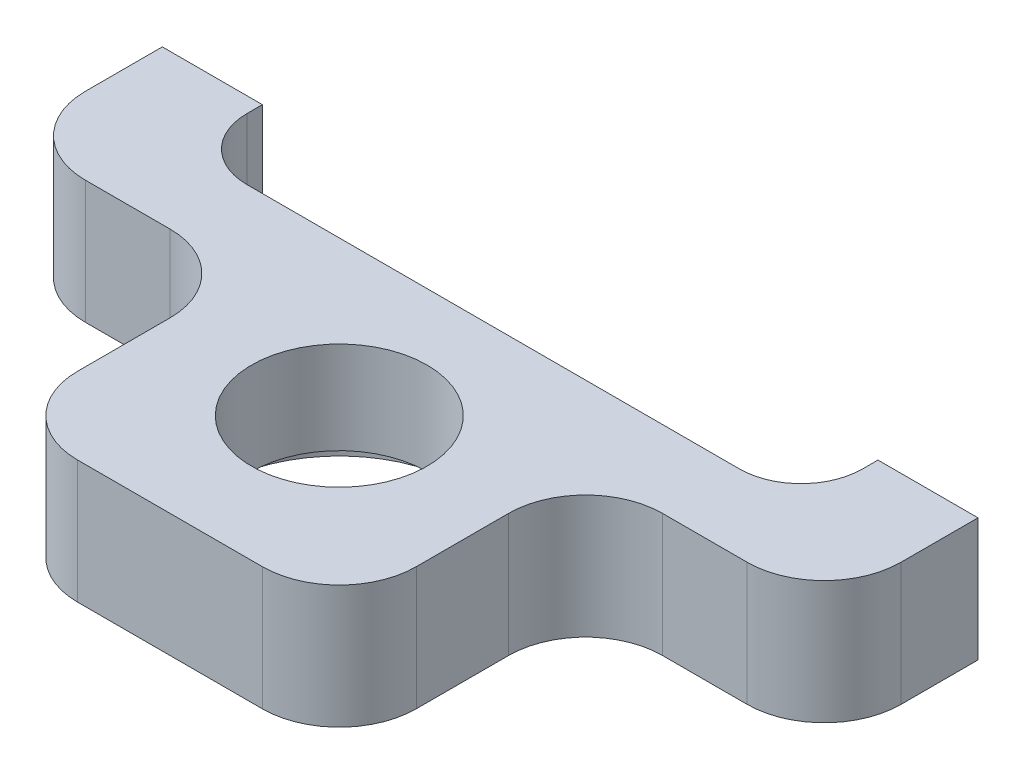
ISO-10303-21;
HEADER;
FILE_DESCRIPTION(('STEP AP214'),'2;1');
FILE_NAME('part.step','',(''),(''),'','','');
FILE_SCHEMA(('AUTOMOTIVE_DESIGN { 1 0 10303 214 1 1 1 1 }'));
ENDSEC;
DATA;
#1=APPLICATION_CONTEXT('core data for automotive mechanical design processes');
#2=APPLICATION_PROTOCOL_DEFINITION('international standard','automotive_design',2000,#1);
#3=PRODUCT_CONTEXT('',#1,'mechanical');
#4=PRODUCT('Part','Part','',(#3));
#5=PRODUCT_RELATED_PRODUCT_CATEGORY('part','',(#4));
#6=PRODUCT_DEFINITION_FORMATION('','',#4);
#7=PRODUCT_DEFINITION_CONTEXT('part definition',#1,'design');
#8=PRODUCT_DEFINITION('design','',#6,#7);
#9=PRODUCT_DEFINITION_SHAPE('','',#8);
#10=(LENGTH_UNIT() NAMED_UNIT(*) SI_UNIT(.MILLI.,.METRE.));
#11=(NAMED_UNIT(*) PLANE_ANGLE_UNIT() SI_UNIT($,.RADIAN.));
#12=(NAMED_UNIT(*) SI_UNIT($,.STERADIAN.) SOLID_ANGLE_UNIT());
#13=UNCERTAINTY_MEASURE_WITH_UNIT(LENGTH_MEASURE(1.E-05),#10,'distance_accuracy_value','');
#14=(GEOMETRIC_REPRESENTATION_CONTEXT(3) GLOBAL_UNCERTAINTY_ASSIGNED_CONTEXT((#13)) GLOBAL_UNIT_ASSIGNED_CONTEXT((#10,
#11,#12)) REPRESENTATION_CONTEXT('',''));
#15=CARTESIAN_POINT('',(0.,0.,0.));
#16=DIRECTION('',(0.,0.,1.));
#17=DIRECTION('',(1.,0.,0.));
#18=AXIS2_PLACEMENT_3D('',#15,#16,#17);
#19=CARTESIAN_POINT('',(-26.5,8.,0.));
#20=DIRECTION('',(0.,0.,-1.));
#21=DIRECTION('',(-1.,0.,0.));
#22=AXIS2_PLACEMENT_3D('',#19,#20,#21);
#23=PLANE('',#22);
#24=CARTESIAN_POINT('',(23.25,4.,0.));
#25=DIRECTION('',(0.,0.,-1.));
#26=DIRECTION('',(-1.,0.,0.));
#27=AXIS2_PLACEMENT_3D('',#24,#25,#26);
#28=CIRCLE('',#27,1.65);
#29=CARTESIAN_POINT('',(21.6,4.,0.));
#30=VERTEX_POINT('',#29);
#31=EDGE_CURVE('E185',#30,#30,#28,.T.);
#32=ORIENTED_EDGE('',*,*,#31,.F.);
#33=EDGE_LOOP('',(#32));
#34=FACE_BOUND('',#33,.T.);
#35=DIRECTION('',(0.,1.,0.));
#36=VECTOR('',#35,1.);
#37=CARTESIAN_POINT('',(20.,0.,0.));
#38=LINE('',#37,#36);
#39=CARTESIAN_POINT('',(20.,0.,0.));
#40=VERTEX_POINT('',#39);
#41=CARTESIAN_POINT('',(20.,8.,0.));
#42=VERTEX_POINT('',#41);
#43=EDGE_CURVE('E224',#40,#42,#38,.T.);
#44=ORIENTED_EDGE('',*,*,#43,.T.);
#45=DIRECTION('',(1.,0.,0.));
#46=VECTOR('',#45,1.);
#47=CARTESIAN_POINT('',(-26.5,8.,0.));
#48=LINE('',#47,#46);
#49=CARTESIAN_POINT('',(26.5,8.,0.));
#50=VERTEX_POINT('',#49);
#51=EDGE_CURVE('E255',#42,#50,#48,.T.);
#52=ORIENTED_EDGE('',*,*,#51,.T.);
#53=DIRECTION('',(0.,-1.,0.));
#54=VECTOR('',#53,1.);
#55=CARTESIAN_POINT('',(26.5,8.,0.));
#56=LINE('',#55,#54);
#57=CARTESIAN_POINT('',(26.5,0.,0.));
#58=VERTEX_POINT('',#57);
#59=EDGE_CURVE('E263',#50,#58,#56,.T.);
#60=ORIENTED_EDGE('',*,*,#59,.T.);
#61=DIRECTION('',(1.,0.,0.));
#62=VECTOR('',#61,1.);
#63=CARTESIAN_POINT('',(-26.5,0.,0.));
#64=LINE('',#63,#62);
#65=EDGE_CURVE('E246',#40,#58,#64,.T.);
#66=ORIENTED_EDGE('',*,*,#65,.F.);
#67=EDGE_LOOP('',(#44,#52,#60,#66));
#68=FACE_BOUND('',#67,.T.);
#69=ADVANCED_FACE('F32',(#34,#68),#23,.T.);
#70=CARTESIAN_POINT('',(-23.25,4.,0.));
#71=DIRECTION('',(0.,0.,-1.));
#72=DIRECTION('',(-1.,0.,0.));
#73=AXIS2_PLACEMENT_3D('',#70,#71,#72);
#74=CIRCLE('',#73,1.65);
#75=CARTESIAN_POINT('',(-24.9,4.,0.));
#76=VERTEX_POINT('',#75);
#77=EDGE_CURVE('E184',#76,#76,#74,.T.);
#78=ORIENTED_EDGE('',*,*,#77,.F.);
#79=EDGE_LOOP('',(#78));
#80=FACE_BOUND('',#79,.T.);
#81=DIRECTION('',(0.,1.,0.));
#82=VECTOR('',#81,1.);
#83=CARTESIAN_POINT('',(-20.000000023,0.,0.));
#84=LINE('',#83,#82);
#85=CARTESIAN_POINT('',(-20.000000023,0.,0.));
#86=VERTEX_POINT('',#85);
#87=CARTESIAN_POINT('',(-20.000000023,8.,0.));
#88=VERTEX_POINT('',#87);
#89=EDGE_CURVE('E217',#86,#88,#84,.T.);
#90=ORIENTED_EDGE('',*,*,#89,.F.);
#91=CARTESIAN_POINT('',(-26.5,0.,0.));
#92=VERTEX_POINT('',#91);
#93=EDGE_CURVE('E264',#92,#86,#64,.T.);
#94=ORIENTED_EDGE('',*,*,#93,.F.);
#95=DIRECTION('',(0.,-1.,0.));
#96=VECTOR('',#95,1.);
#97=CARTESIAN_POINT('',(-26.5,8.,0.));
#98=LINE('',#97,#96);
#99=CARTESIAN_POINT('',(-26.5,8.,0.));
#100=VERTEX_POINT('',#99);
#101=EDGE_CURVE('E275',#100,#92,#98,.T.);
#102=ORIENTED_EDGE('',*,*,#101,.F.);
#103=EDGE_CURVE('E251',#100,#88,#48,.T.);
#104=ORIENTED_EDGE('',*,*,#103,.T.);
#105=EDGE_LOOP('',(#90,#94,#102,#104));
#106=FACE_BOUND('',#105,.T.);
#107=ADVANCED_FACE('F371',(#80,#106),#23,.T.);
#108=CARTESIAN_POINT('',(-26.5,8.,26.));
#109=DIRECTION('',(-1.,0.,0.));
#110=DIRECTION('',(0.,0.,1.));
#111=AXIS2_PLACEMENT_3D('',#108,#109,#110);
#112=PLANE('',#111);
#113=DIRECTION('',(0.,0.,-1.));
#114=VECTOR('',#113,1.);
#115=CARTESIAN_POINT('',(-26.5,0.,26.));
#116=LINE('',#115,#114);
#117=CARTESIAN_POINT('',(-26.5,0.,5.));
#118=VERTEX_POINT('',#117);
#119=EDGE_CURVE('E273',#118,#92,#116,.T.);
#120=ORIENTED_EDGE('',*,*,#119,.F.);
#121=DIRECTION('',(0.,1.,0.));
#122=VECTOR('',#121,1.);
#123=CARTESIAN_POINT('',(-26.5,8.,5.00000000000001));
#124=LINE('',#123,#122);
#125=CARTESIAN_POINT('',(-26.5,8.,5.));
#126=VERTEX_POINT('',#125);
#127=EDGE_CURVE('E320',#118,#126,#124,.T.);
#128=ORIENTED_EDGE('',*,*,#127,.T.);
#129=DIRECTION('',(0.,0.,-1.));
#130=VECTOR('',#129,1.);
#131=CARTESIAN_POINT('',(-26.5,8.,26.));
#132=LINE('',#131,#130);
#133=EDGE_CURVE('E261',#126,#100,#132,.T.);
#134=ORIENTED_EDGE('',*,*,#133,.T.);
#135=ORIENTED_EDGE('',*,*,#101,.T.);
#136=EDGE_LOOP('',(#120,#128,#134,#135));
#137=FACE_BOUND('',#136,.T.);
#138=ADVANCED_FACE('F365',(#137),#112,.T.);
#139=CARTESIAN_POINT('',(26.5,8.,26.));
#140=DIRECTION('',(0.,0.,1.));
#141=DIRECTION('',(1.,0.,0.));
#142=AXIS2_PLACEMENT_3D('',#139,#140,#141);
#143=PLANE('',#142);
#144=DIRECTION('',(-1.,0.,0.));
#145=VECTOR('',#144,1.);
#146=CARTESIAN_POINT('',(26.5,0.,26.));
#147=LINE('',#146,#145);
#148=CARTESIAN_POINT('',(6.,0.,26.));
#149=VERTEX_POINT('',#148);
#150=CARTESIAN_POINT('',(-6.,0.,26.));
#151=VERTEX_POINT('',#150);
#152=EDGE_CURVE('E270',#149,#151,#147,.T.);
#153=ORIENTED_EDGE('',*,*,#152,.F.);
#154=DIRECTION('',(0.,1.,0.));
#155=VECTOR('',#154,1.);
#156=CARTESIAN_POINT('',(6.,8.,26.));
#157=LINE('',#156,#155);
#158=CARTESIAN_POINT('',(6.,8.,26.));
#159=VERTEX_POINT('',#158);
#160=EDGE_CURVE('E334',#149,#159,#157,.T.);
#161=ORIENTED_EDGE('',*,*,#160,.T.);
#162=DIRECTION('',(-1.,0.,0.));
#163=VECTOR('',#162,1.);
#164=CARTESIAN_POINT('',(26.5,8.,26.));
#165=LINE('',#164,#163);
#166=CARTESIAN_POINT('',(-6.,8.,26.));
#167=VERTEX_POINT('',#166);
#168=EDGE_CURVE('E258',#159,#167,#165,.T.);
#169=ORIENTED_EDGE('',*,*,#168,.T.);
#170=DIRECTION('',(0.,1.,0.));
#171=VECTOR('',#170,1.);
#172=CARTESIAN_POINT('',(-6.,0.,26.));
#173=LINE('',#172,#171);
#174=EDGE_CURVE('E332',#167,#151,#173,.F.);
#175=ORIENTED_EDGE('',*,*,#174,.T.);
#176=EDGE_LOOP('',(#153,#161,#169,#175));
#177=FACE_BOUND('',#176,.T.);
#178=ADVANCED_FACE('F426',(#177),#143,.T.);
#179=CARTESIAN_POINT('',(26.5,8.,0.));
#180=DIRECTION('',(1.,0.,0.));
#181=DIRECTION('',(0.,0.,-1.));
#182=AXIS2_PLACEMENT_3D('',#179,#180,#181);
#183=PLANE('',#182);
#184=DIRECTION('',(0.,0.,1.));
#185=VECTOR('',#184,1.);
#186=CARTESIAN_POINT('',(26.5,8.,0.));
#187=LINE('',#186,#185);
#188=CARTESIAN_POINT('',(26.5,8.,5.));
#189=VERTEX_POINT('',#188);
#190=EDGE_CURVE('E254',#50,#189,#187,.T.);
#191=ORIENTED_EDGE('',*,*,#190,.T.);
#192=DIRECTION('',(0.,1.,0.));
#193=VECTOR('',#192,1.);
#194=CARTESIAN_POINT('',(26.5,0.,5.));
#195=LINE('',#194,#193);
#196=CARTESIAN_POINT('',(26.5,0.,5.));
#197=VERTEX_POINT('',#196);
#198=EDGE_CURVE('E311',#189,#197,#195,.F.);
#199=ORIENTED_EDGE('',*,*,#198,.T.);
#200=DIRECTION('',(0.,0.,1.));
#201=VECTOR('',#200,1.);
#202=CARTESIAN_POINT('',(26.5,0.,0.));
#203=LINE('',#202,#201);
#204=EDGE_CURVE('E267',#58,#197,#203,.T.);
#205=ORIENTED_EDGE('',*,*,#204,.F.);
#206=ORIENTED_EDGE('',*,*,#59,.F.);
#207=EDGE_LOOP('',(#191,#199,#205,#206));
#208=FACE_BOUND('',#207,.T.);
#209=ADVANCED_FACE('F401',(#208),#183,.T.);
#210=CARTESIAN_POINT('',(0.,8.,0.));
#211=DIRECTION('',(0.,-1.,0.));
#212=DIRECTION('',(0.,0.,-1.));
#213=AXIS2_PLACEMENT_3D('',#210,#211,#212);
#214=PLANE('',#213);
#215=CARTESIAN_POINT('',(0.,8.00000000000001,15.));
#216=DIRECTION('',(0.,-1.,0.));
#217=DIRECTION('',(0.,0.,-1.));
#218=AXIS2_PLACEMENT_3D('',#215,#216,#217);
#219=CIRCLE('',#218,5.70000000000001);
#220=CARTESIAN_POINT('',(0.,8.00000000000001,9.29999999999999));
#221=VERTEX_POINT('',#220);
#222=EDGE_CURVE('E204',#221,#221,#219,.T.);
#223=ORIENTED_EDGE('',*,*,#222,.T.);
#224=EDGE_LOOP('',(#223));
#225=FACE_BOUND('',#224,.T.);
#226=DIRECTION('',(-1.,0.,0.));
#227=VECTOR('',#226,1.);
#228=CARTESIAN_POINT('',(26.5,8.,10.));
#229=LINE('',#228,#227);
#230=CARTESIAN_POINT('',(21.5,8.,10.));
#231=VERTEX_POINT('',#230);
#232=CARTESIAN_POINT('',(16.,8.,10.));
#233=VERTEX_POINT('',#232);
#234=EDGE_CURVE('E235',#231,#233,#229,.T.);
#235=ORIENTED_EDGE('',*,*,#234,.F.);
#236=CARTESIAN_POINT('',(21.5,8.,5.));
#237=DIRECTION('',(0.,-1.,0.));
#238=DIRECTION('',(0.,0.,-1.));
#239=AXIS2_PLACEMENT_3D('',#236,#237,#238);
#240=CIRCLE('',#239,5.);
#241=EDGE_CURVE('E309',#231,#189,#240,.F.);
#242=ORIENTED_EDGE('',*,*,#241,.T.);
#243=ORIENTED_EDGE('',*,*,#190,.F.);
#244=ORIENTED_EDGE('',*,*,#51,.F.);
#245=DIRECTION('',(0.,0.,-1.));
#246=VECTOR('',#245,1.);
#247=CARTESIAN_POINT('',(20.,8.,5.));
#248=LINE('',#247,#246);
#249=CARTESIAN_POINT('',(20.,8.,1.));
#250=VERTEX_POINT('',#249);
#251=EDGE_CURVE('E212',#250,#42,#248,.T.);
#252=ORIENTED_EDGE('',*,*,#251,.F.);
#253=CARTESIAN_POINT('',(16.,8.,1.));
#254=DIRECTION('',(0.,-1.,0.));
#255=DIRECTION('',(0.,0.,-1.));
#256=AXIS2_PLACEMENT_3D('',#253,#254,#255);
#257=CIRCLE('',#256,4.);
#258=CARTESIAN_POINT('',(16.,8.,5.));
#259=VERTEX_POINT('',#258);
#260=EDGE_CURVE('E294',#250,#259,#257,.T.);
#261=ORIENTED_EDGE('',*,*,#260,.T.);
#262=DIRECTION('',(1.,0.,0.));
#263=VECTOR('',#262,1.);
#264=CARTESIAN_POINT('',(-20.000000023,8.,5.00000000000001));
#265=LINE('',#264,#263);
#266=CARTESIAN_POINT('',(-16.000000023,8.,5.00000000000001));
#267=VERTEX_POINT('',#266);
#268=EDGE_CURVE('E220',#267,#259,#265,.T.);
#269=ORIENTED_EDGE('',*,*,#268,.F.);
#270=CARTESIAN_POINT('',(-16.000000023,8.,1.00000000000001));
#271=DIRECTION('',(0.,-1.,0.));
#272=DIRECTION('',(0.,0.,-1.));
#273=AXIS2_PLACEMENT_3D('',#270,#271,#272);
#274=CIRCLE('',#273,4.);
#275=CARTESIAN_POINT('',(-20.000000023,8.,1.00000000000001));
#276=VERTEX_POINT('',#275);
#277=EDGE_CURVE('E290',#267,#276,#274,.T.);
#278=ORIENTED_EDGE('',*,*,#277,.T.);
#279=DIRECTION('',(0.,0.,1.));
#280=VECTOR('',#279,1.);
#281=CARTESIAN_POINT('',(-20.000000023,8.,0.));
#282=LINE('',#281,#280);
#283=EDGE_CURVE('E207',#88,#276,#282,.T.);
#284=ORIENTED_EDGE('',*,*,#283,.F.);
#285=ORIENTED_EDGE('',*,*,#103,.F.);
#286=ORIENTED_EDGE('',*,*,#133,.F.);
#287=CARTESIAN_POINT('',(-21.5,8.,5.));
#288=DIRECTION('',(0.,-1.,0.));
#289=DIRECTION('',(0.,0.,-1.));
#290=AXIS2_PLACEMENT_3D('',#287,#288,#289);
#291=CIRCLE('',#290,5.);
#292=CARTESIAN_POINT('',(-21.5,8.,10.));
#293=VERTEX_POINT('',#292);
#294=EDGE_CURVE('E307',#126,#293,#291,.F.);
#295=ORIENTED_EDGE('',*,*,#294,.T.);
#296=DIRECTION('',(-1.,0.,0.));
#297=VECTOR('',#296,1.);
#298=CARTESIAN_POINT('',(-11.,8.,10.));
#299=LINE('',#298,#297);
#300=CARTESIAN_POINT('',(-16.,8.,10.));
#301=VERTEX_POINT('',#300);
#302=EDGE_CURVE('E233',#301,#293,#299,.T.);
#303=ORIENTED_EDGE('',*,*,#302,.F.);
#304=CARTESIAN_POINT('',(-16.,8.,15.));
#305=DIRECTION('',(0.,-1.,0.));
#306=DIRECTION('',(0.,0.,-1.));
#307=AXIS2_PLACEMENT_3D('',#304,#305,#306);
#308=CIRCLE('',#307,5.);
#309=CARTESIAN_POINT('',(-11.,8.,15.));
#310=VERTEX_POINT('',#309);
#311=EDGE_CURVE('E40',#301,#310,#308,.T.);
#312=ORIENTED_EDGE('',*,*,#311,.T.);
#313=DIRECTION('',(0.,0.,-1.));
#314=VECTOR('',#313,1.);
#315=CARTESIAN_POINT('',(-11.,8.,26.));
#316=LINE('',#315,#314);
#317=CARTESIAN_POINT('',(-11.,8.,21.));
#318=VERTEX_POINT('',#317);
#319=EDGE_CURVE('E227',#318,#310,#316,.T.);
#320=ORIENTED_EDGE('',*,*,#319,.F.);
#321=CARTESIAN_POINT('',(-6.,8.,21.));
#322=DIRECTION('',(0.,-1.,0.));
#323=DIRECTION('',(0.,0.,-1.));
#324=AXIS2_PLACEMENT_3D('',#321,#322,#323);
#325=CIRCLE('',#324,5.);
#326=EDGE_CURVE('E303',#318,#167,#325,.F.);
#327=ORIENTED_EDGE('',*,*,#326,.T.);
#328=ORIENTED_EDGE('',*,*,#168,.F.);
#329=CARTESIAN_POINT('',(6.,8.,21.));
#330=DIRECTION('',(0.,-1.,0.));
#331=DIRECTION('',(0.,0.,-1.));
#332=AXIS2_PLACEMENT_3D('',#329,#330,#331);
#333=CIRCLE('',#332,5.);
#334=CARTESIAN_POINT('',(11.,8.,21.));
#335=VERTEX_POINT('',#334);
#336=EDGE_CURVE('E305',#159,#335,#333,.F.);
#337=ORIENTED_EDGE('',*,*,#336,.T.);
#338=DIRECTION('',(0.,0.,1.));
#339=VECTOR('',#338,1.);
#340=CARTESIAN_POINT('',(11.,8.,10.));
#341=LINE('',#340,#339);
#342=CARTESIAN_POINT('',(11.,8.,15.));
#343=VERTEX_POINT('',#342);
#344=EDGE_CURVE('E243',#343,#335,#341,.T.);
#345=ORIENTED_EDGE('',*,*,#344,.F.);
#346=CARTESIAN_POINT('',(16.,8.,15.));
#347=DIRECTION('',(0.,-1.,0.));
#348=DIRECTION('',(0.,0.,-1.));
#349=AXIS2_PLACEMENT_3D('',#346,#347,#348);
#350=CIRCLE('',#349,5.);
#351=EDGE_CURVE('E342',#343,#233,#350,.T.);
#352=ORIENTED_EDGE('',*,*,#351,.T.);
#353=EDGE_LOOP('',(#235,#242,#243,#244,#252,#261,#269,#278,#284,#285,#286,#295,#303,#312,#320,
#327,#328,#337,#345,#352));
#354=FACE_BOUND('',#353,.T.);
#355=ADVANCED_FACE('F349',(#225,#354),#214,.F.);
#356=CARTESIAN_POINT('',(0.,0.,0.));
#357=DIRECTION('',(0.,-1.,0.));
#358=DIRECTION('',(0.,0.,-1.));
#359=AXIS2_PLACEMENT_3D('',#356,#357,#358);
#360=PLANE('',#359);
#361=CARTESIAN_POINT('',(0.,0.,15.));
#362=DIRECTION('',(0.,-1.,0.));
#363=DIRECTION('',(0.,0.,-1.));
#364=AXIS2_PLACEMENT_3D('',#361,#362,#363);
#365=CIRCLE('',#364,8.1);
#366=CARTESIAN_POINT('',(0.,0.,6.9));
#367=VERTEX_POINT('',#366);
#368=EDGE_CURVE('E195',#367,#367,#365,.T.);
#369=ORIENTED_EDGE('',*,*,#368,.F.);
#370=EDGE_LOOP('',(#369));
#371=FACE_BOUND('',#370,.T.);
#372=ORIENTED_EDGE('',*,*,#204,.T.);
#373=CARTESIAN_POINT('',(21.5,0.,5.));
#374=DIRECTION('',(0.,-1.,0.));
#375=DIRECTION('',(0.,0.,-1.));
#376=AXIS2_PLACEMENT_3D('',#373,#374,#375);
#377=CIRCLE('',#376,5.);
#378=CARTESIAN_POINT('',(21.5,0.,10.));
#379=VERTEX_POINT('',#378);
#380=EDGE_CURVE('E318',#197,#379,#377,.T.);
#381=ORIENTED_EDGE('',*,*,#380,.T.);
#382=DIRECTION('',(-1.,0.,0.));
#383=VECTOR('',#382,1.);
#384=CARTESIAN_POINT('',(26.5,0.,10.));
#385=LINE('',#384,#383);
#386=CARTESIAN_POINT('',(16.,0.,10.));
#387=VERTEX_POINT('',#386);
#388=EDGE_CURVE('E239',#379,#387,#385,.T.);
#389=ORIENTED_EDGE('',*,*,#388,.T.);
#390=CARTESIAN_POINT('',(16.,0.,15.));
#391=DIRECTION('',(0.,-1.,0.));
#392=DIRECTION('',(0.,0.,-1.));
#393=AXIS2_PLACEMENT_3D('',#390,#391,#392);
#394=CIRCLE('',#393,5.);
#395=CARTESIAN_POINT('',(11.,0.,15.));
#396=VERTEX_POINT('',#395);
#397=EDGE_CURVE('E344',#387,#396,#394,.F.);
#398=ORIENTED_EDGE('',*,*,#397,.T.);
#399=DIRECTION('',(0.,0.,1.));
#400=VECTOR('',#399,1.);
#401=CARTESIAN_POINT('',(11.,0.,10.));
#402=LINE('',#401,#400);
#403=CARTESIAN_POINT('',(11.,0.,21.));
#404=VERTEX_POINT('',#403);
#405=EDGE_CURVE('E242',#396,#404,#402,.T.);
#406=ORIENTED_EDGE('',*,*,#405,.T.);
#407=CARTESIAN_POINT('',(6.,0.,21.));
#408=DIRECTION('',(0.,-1.,0.));
#409=DIRECTION('',(0.,0.,-1.));
#410=AXIS2_PLACEMENT_3D('',#407,#408,#409);
#411=CIRCLE('',#410,5.);
#412=EDGE_CURVE('E315',#404,#149,#411,.T.);
#413=ORIENTED_EDGE('',*,*,#412,.T.);
#414=ORIENTED_EDGE('',*,*,#152,.T.);
#415=CARTESIAN_POINT('',(-6.,0.,21.));
#416=DIRECTION('',(0.,-1.,0.));
#417=DIRECTION('',(0.,0.,-1.));
#418=AXIS2_PLACEMENT_3D('',#415,#416,#417);
#419=CIRCLE('',#418,5.);
#420=CARTESIAN_POINT('',(-11.,0.,21.));
#421=VERTEX_POINT('',#420);
#422=EDGE_CURVE('E313',#151,#421,#419,.T.);
#423=ORIENTED_EDGE('',*,*,#422,.T.);
#424=DIRECTION('',(0.,0.,-1.));
#425=VECTOR('',#424,1.);
#426=CARTESIAN_POINT('',(-11.,0.,26.));
#427=LINE('',#426,#425);
#428=CARTESIAN_POINT('',(-11.,0.,15.));
#429=VERTEX_POINT('',#428);
#430=EDGE_CURVE('E229',#421,#429,#427,.T.);
#431=ORIENTED_EDGE('',*,*,#430,.T.);
#432=CARTESIAN_POINT('',(-16.,0.,15.));
#433=DIRECTION('',(0.,-1.,0.));
#434=DIRECTION('',(0.,0.,-1.));
#435=AXIS2_PLACEMENT_3D('',#432,#433,#434);
#436=CIRCLE('',#435,5.);
#437=CARTESIAN_POINT('',(-16.,0.,10.));
#438=VERTEX_POINT('',#437);
#439=EDGE_CURVE('E11',#429,#438,#436,.F.);
#440=ORIENTED_EDGE('',*,*,#439,.T.);
#441=DIRECTION('',(-1.,0.,0.));
#442=VECTOR('',#441,1.);
#443=CARTESIAN_POINT('',(-11.,0.,10.));
#444=LINE('',#443,#442);
#445=CARTESIAN_POINT('',(-21.5,0.,10.));
#446=VERTEX_POINT('',#445);
#447=EDGE_CURVE('E232',#438,#446,#444,.T.);
#448=ORIENTED_EDGE('',*,*,#447,.T.);
#449=CARTESIAN_POINT('',(-21.5,0.,5.));
#450=DIRECTION('',(0.,-1.,0.));
#451=DIRECTION('',(0.,0.,-1.));
#452=AXIS2_PLACEMENT_3D('',#449,#450,#451);
#453=CIRCLE('',#452,5.);
#454=EDGE_CURVE('E47',#446,#118,#453,.T.);
#455=ORIENTED_EDGE('',*,*,#454,.T.);
#456=ORIENTED_EDGE('',*,*,#119,.T.);
#457=ORIENTED_EDGE('',*,*,#93,.T.);
#458=DIRECTION('',(0.,0.,1.));
#459=VECTOR('',#458,1.);
#460=CARTESIAN_POINT('',(-20.000000023,0.,0.));
#461=LINE('',#460,#459);
#462=CARTESIAN_POINT('',(-20.000000023,0.,1.00000000000001));
#463=VERTEX_POINT('',#462);
#464=EDGE_CURVE('E208',#86,#463,#461,.T.);
#465=ORIENTED_EDGE('',*,*,#464,.T.);
#466=CARTESIAN_POINT('',(-16.000000023,0.,1.00000000000001));
#467=DIRECTION('',(0.,-1.,0.));
#468=DIRECTION('',(0.,0.,-1.));
#469=AXIS2_PLACEMENT_3D('',#466,#467,#468);
#470=CIRCLE('',#469,4.);
#471=CARTESIAN_POINT('',(-16.000000023,0.,5.00000000000001));
#472=VERTEX_POINT('',#471);
#473=EDGE_CURVE('E292',#463,#472,#470,.F.);
#474=ORIENTED_EDGE('',*,*,#473,.T.);
#475=DIRECTION('',(1.,0.,0.));
#476=VECTOR('',#475,1.);
#477=CARTESIAN_POINT('',(-20.000000023,0.,5.00000000000001));
#478=LINE('',#477,#476);
#479=CARTESIAN_POINT('',(16.,0.,5.));
#480=VERTEX_POINT('',#479);
#481=EDGE_CURVE('E211',#472,#480,#478,.T.);
#482=ORIENTED_EDGE('',*,*,#481,.T.);
#483=CARTESIAN_POINT('',(16.,0.,1.));
#484=DIRECTION('',(0.,-1.,0.));
#485=DIRECTION('',(0.,0.,-1.));
#486=AXIS2_PLACEMENT_3D('',#483,#484,#485);
#487=CIRCLE('',#486,4.);
#488=CARTESIAN_POINT('',(20.,0.,1.));
#489=VERTEX_POINT('',#488);
#490=EDGE_CURVE('E296',#480,#489,#487,.F.);
#491=ORIENTED_EDGE('',*,*,#490,.T.);
#492=DIRECTION('',(0.,0.,-1.));
#493=VECTOR('',#492,1.);
#494=CARTESIAN_POINT('',(20.,0.,5.));
#495=LINE('',#494,#493);
#496=EDGE_CURVE('E215',#489,#40,#495,.T.);
#497=ORIENTED_EDGE('',*,*,#496,.T.);
#498=ORIENTED_EDGE('',*,*,#65,.T.);
#499=EDGE_LOOP('',(#372,#381,#389,#398,#406,#413,#414,#423,#431,#440,#448,#455,#456,#457,#465,
#474,#482,#491,#497,#498));
#500=FACE_BOUND('',#499,.T.);
#501=ADVANCED_FACE('F358',(#371,#500),#360,.T.);
#502=CARTESIAN_POINT('',(26.5,0.,10.));
#503=DIRECTION('',(0.,0.,-1.));
#504=DIRECTION('',(-1.,0.,0.));
#505=AXIS2_PLACEMENT_3D('',#502,#503,#504);
#506=PLANE('',#505);
#507=ORIENTED_EDGE('',*,*,#388,.F.);
#508=DIRECTION('',(0.,1.,0.));
#509=VECTOR('',#508,1.);
#510=CARTESIAN_POINT('',(21.5,8.,10.));
#511=LINE('',#510,#509);
#512=EDGE_CURVE('E300',#379,#231,#511,.T.);
#513=ORIENTED_EDGE('',*,*,#512,.T.);
#514=ORIENTED_EDGE('',*,*,#234,.T.);
#515=DIRECTION('',(0.,1.,0.));
#516=VECTOR('',#515,1.);
#517=CARTESIAN_POINT('',(16.,0.,10.));
#518=LINE('',#517,#516);
#519=EDGE_CURVE('E298',#233,#387,#518,.F.);
#520=ORIENTED_EDGE('',*,*,#519,.T.);
#521=EDGE_LOOP('',(#507,#513,#514,#520));
#522=FACE_BOUND('',#521,.T.);
#523=ADVANCED_FACE('F409',(#522),#506,.F.);
#524=CARTESIAN_POINT('',(11.,0.,10.));
#525=DIRECTION('',(-1.,0.,0.));
#526=DIRECTION('',(0.,0.,1.));
#527=AXIS2_PLACEMENT_3D('',#524,#525,#526);
#528=PLANE('',#527);
#529=ORIENTED_EDGE('',*,*,#405,.F.);
#530=DIRECTION('',(0.,1.,0.));
#531=VECTOR('',#530,1.);
#532=CARTESIAN_POINT('',(11.,8.,15.));
#533=LINE('',#532,#531);
#534=EDGE_CURVE('E329',#396,#343,#533,.T.);
#535=ORIENTED_EDGE('',*,*,#534,.T.);
#536=ORIENTED_EDGE('',*,*,#344,.T.);
#537=DIRECTION('',(0.,1.,0.));
#538=VECTOR('',#537,1.);
#539=CARTESIAN_POINT('',(11.,0.,21.));
#540=LINE('',#539,#538);
#541=EDGE_CURVE('E327',#335,#404,#540,.F.);
#542=ORIENTED_EDGE('',*,*,#541,.T.);
#543=EDGE_LOOP('',(#529,#535,#536,#542));
#544=FACE_BOUND('',#543,.T.);
#545=ADVANCED_FACE('F417',(#544),#528,.F.);
#546=CARTESIAN_POINT('',(-11.,0.,10.));
#547=DIRECTION('',(0.,0.,-1.));
#548=DIRECTION('',(-1.,0.,0.));
#549=AXIS2_PLACEMENT_3D('',#546,#547,#548);
#550=PLANE('',#549);
#551=ORIENTED_EDGE('',*,*,#302,.T.);
#552=DIRECTION('',(0.,1.,0.));
#553=VECTOR('',#552,1.);
#554=CARTESIAN_POINT('',(-21.5,0.,10.));
#555=LINE('',#554,#553);
#556=EDGE_CURVE('E55',#293,#446,#555,.F.);
#557=ORIENTED_EDGE('',*,*,#556,.T.);
#558=ORIENTED_EDGE('',*,*,#447,.F.);
#559=DIRECTION('',(0.,1.,0.));
#560=VECTOR('',#559,1.);
#561=CARTESIAN_POINT('',(-16.,8.,10.));
#562=LINE('',#561,#560);
#563=EDGE_CURVE('E323',#438,#301,#562,.T.);
#564=ORIENTED_EDGE('',*,*,#563,.T.);
#565=EDGE_LOOP('',(#551,#557,#558,#564));
#566=FACE_BOUND('',#565,.T.);
#567=ADVANCED_FACE('F359',(#566),#550,.F.);
#568=CARTESIAN_POINT('',(-11.,0.,26.));
#569=DIRECTION('',(1.,0.,0.));
#570=DIRECTION('',(0.,0.,-1.));
#571=AXIS2_PLACEMENT_3D('',#568,#569,#570);
#572=PLANE('',#571);
#573=ORIENTED_EDGE('',*,*,#430,.F.);
#574=DIRECTION('',(0.,1.,0.));
#575=VECTOR('',#574,1.);
#576=CARTESIAN_POINT('',(-11.,8.,21.));
#577=LINE('',#576,#575);
#578=EDGE_CURVE('E339',#421,#318,#577,.T.);
#579=ORIENTED_EDGE('',*,*,#578,.T.);
#580=ORIENTED_EDGE('',*,*,#319,.T.);
#581=DIRECTION('',(0.,1.,0.));
#582=VECTOR('',#581,1.);
#583=CARTESIAN_POINT('',(-11.,0.,15.));
#584=LINE('',#583,#582);
#585=EDGE_CURVE('E337',#310,#429,#584,.F.);
#586=ORIENTED_EDGE('',*,*,#585,.T.);
#587=EDGE_LOOP('',(#573,#579,#580,#586));
#588=FACE_BOUND('',#587,.T.);
#589=ADVANCED_FACE('F355',(#588),#572,.F.);
#590=CARTESIAN_POINT('',(20.,0.,5.));
#591=DIRECTION('',(1.,0.,0.));
#592=DIRECTION('',(0.,0.,-1.));
#593=AXIS2_PLACEMENT_3D('',#590,#591,#592);
#594=PLANE('',#593);
#595=ORIENTED_EDGE('',*,*,#496,.F.);
#596=DIRECTION('',(0.,1.,0.));
#597=VECTOR('',#596,1.);
#598=CARTESIAN_POINT('',(20.,8.,1.));
#599=LINE('',#598,#597);
#600=EDGE_CURVE('E287',#489,#250,#599,.T.);
#601=ORIENTED_EDGE('',*,*,#600,.T.);
#602=ORIENTED_EDGE('',*,*,#251,.T.);
#603=ORIENTED_EDGE('',*,*,#43,.F.);
#604=EDGE_LOOP('',(#595,#601,#602,#603));
#605=FACE_BOUND('',#604,.T.);
#606=ADVANCED_FACE('F392',(#605),#594,.F.);
#607=CARTESIAN_POINT('',(-20.000000023,0.,5.00000000000001));
#608=DIRECTION('',(0.,0.,1.));
#609=DIRECTION('',(1.,0.,0.));
#610=AXIS2_PLACEMENT_3D('',#607,#608,#609);
#611=PLANE('',#610);
#612=ORIENTED_EDGE('',*,*,#481,.F.);
#613=DIRECTION('',(0.,1.,0.));
#614=VECTOR('',#613,1.);
#615=CARTESIAN_POINT('',(-16.000000023,8.,5.00000000000001));
#616=LINE('',#615,#614);
#617=EDGE_CURVE('E282',#472,#267,#616,.T.);
#618=ORIENTED_EDGE('',*,*,#617,.T.);
#619=ORIENTED_EDGE('',*,*,#268,.T.);
#620=DIRECTION('',(0.,1.,0.));
#621=VECTOR('',#620,1.);
#622=CARTESIAN_POINT('',(16.,0.,5.));
#623=LINE('',#622,#621);
#624=EDGE_CURVE('E278',#259,#480,#623,.F.);
#625=ORIENTED_EDGE('',*,*,#624,.T.);
#626=EDGE_LOOP('',(#612,#618,#619,#625));
#627=FACE_BOUND('',#626,.T.);
#628=ADVANCED_FACE('F382',(#627),#611,.F.);
#629=CARTESIAN_POINT('',(-20.000000023,0.,0.));
#630=DIRECTION('',(-1.,0.,0.));
#631=DIRECTION('',(0.,0.,1.));
#632=AXIS2_PLACEMENT_3D('',#629,#630,#631);
#633=PLANE('',#632);
#634=ORIENTED_EDGE('',*,*,#283,.T.);
#635=DIRECTION('',(0.,1.,0.));
#636=VECTOR('',#635,1.);
#637=CARTESIAN_POINT('',(-20.000000023,0.,1.00000000000001));
#638=LINE('',#637,#636);
#639=EDGE_CURVE('E285',#276,#463,#638,.F.);
#640=ORIENTED_EDGE('',*,*,#639,.T.);
#641=ORIENTED_EDGE('',*,*,#464,.F.);
#642=ORIENTED_EDGE('',*,*,#89,.T.);
#643=EDGE_LOOP('',(#634,#640,#641,#642));
#644=FACE_BOUND('',#643,.T.);
#645=ADVANCED_FACE('F559',(#644),#633,.F.);
#646=CARTESIAN_POINT('',(0.,0.,15.));
#647=DIRECTION('',(0.,-1.,0.));
#648=DIRECTION('',(0.,0.,-1.));
#649=AXIS2_PLACEMENT_3D('',#646,#647,#648);
#650=CYLINDRICAL_SURFACE('',#649,5.70000000000001);
#651=ORIENTED_EDGE('',*,*,#222,.F.);
#652=EDGE_LOOP('',(#651));
#653=FACE_BOUND('',#652,.T.);
#654=CARTESIAN_POINT('',(0.,2.,15.));
#655=DIRECTION('',(0.,-1.,0.));
#656=DIRECTION('',(0.,0.,-1.));
#657=AXIS2_PLACEMENT_3D('',#654,#655,#656);
#658=CIRCLE('',#657,5.70000000000001);
#659=CARTESIAN_POINT('',(0.,2.,9.29999999999999));
#660=VERTEX_POINT('',#659);
#661=EDGE_CURVE('E201',#660,#660,#658,.T.);
#662=ORIENTED_EDGE('',*,*,#661,.T.);
#663=EDGE_LOOP('',(#662));
#664=FACE_BOUND('',#663,.T.);
#665=ADVANCED_FACE('F550',(#653,#664),#650,.F.);
#666=CARTESIAN_POINT('',(5.70000000000001,2.,15.));
#667=DIRECTION('',(0.,1.,0.));
#668=DIRECTION('',(0.,0.,1.));
#669=AXIS2_PLACEMENT_3D('',#666,#667,#668);
#670=PLANE('',#669);
#671=ORIENTED_EDGE('',*,*,#661,.F.);
#672=EDGE_LOOP('',(#671));
#673=FACE_BOUND('',#672,.T.);
#674=CARTESIAN_POINT('',(0.,2.,15.));
#675=DIRECTION('',(0.,-1.,0.));
#676=DIRECTION('',(0.,0.,-1.));
#677=AXIS2_PLACEMENT_3D('',#674,#675,#676);
#678=CIRCLE('',#677,8.1);
#679=CARTESIAN_POINT('',(0.,2.,6.9));
#680=VERTEX_POINT('',#679);
#681=EDGE_CURVE('E198',#680,#680,#678,.T.);
#682=ORIENTED_EDGE('',*,*,#681,.T.);
#683=EDGE_LOOP('',(#682));
#684=FACE_BOUND('',#683,.T.);
#685=ADVANCED_FACE('F541',(#673,#684),#670,.F.);
#686=CARTESIAN_POINT('',(0.,0.,15.));
#687=DIRECTION('',(0.,-1.,0.));
#688=DIRECTION('',(0.,0.,-1.));
#689=AXIS2_PLACEMENT_3D('',#686,#687,#688);
#690=CYLINDRICAL_SURFACE('',#689,8.1);
#691=ORIENTED_EDGE('',*,*,#681,.F.);
#692=EDGE_LOOP('',(#691));
#693=FACE_BOUND('',#692,.T.);
#694=ORIENTED_EDGE('',*,*,#368,.T.);
#695=EDGE_LOOP('',(#694));
#696=FACE_BOUND('',#695,.T.);
#697=ADVANCED_FACE('F531',(#693,#696),#690,.F.);
#698=CARTESIAN_POINT('',(-23.25,4.,6.));
#699=DIRECTION('',(0.,0.,-1.));
#700=DIRECTION('',(-1.,0.,0.));
#701=AXIS2_PLACEMENT_3D('',#698,#699,#700);
#702=CONICAL_SURFACE('',#701,1.65,1.02974425867665);
#703=CARTESIAN_POINT('',(-23.25,4.,6.99142002139547));
#704=VERTEX_POINT('',#703);
#705=VERTEX_LOOP('',#704);
#706=FACE_BOUND('',#705,.T.);
#707=CARTESIAN_POINT('',(-23.25,4.,6.));
#708=DIRECTION('',(0.,0.,-1.));
#709=DIRECTION('',(-1.,0.,0.));
#710=AXIS2_PLACEMENT_3D('',#707,#708,#709);
#711=CIRCLE('',#710,1.65);
#712=CARTESIAN_POINT('',(-24.9,4.,6.));
#713=VERTEX_POINT('',#712);
#714=EDGE_CURVE('E188',#713,#713,#711,.T.);
#715=ORIENTED_EDGE('',*,*,#714,.T.);
#716=EDGE_LOOP('',(#715));
#717=FACE_BOUND('',#716,.T.);
#718=ADVANCED_FACE('F522',(#706,#717),#702,.F.);
#719=CARTESIAN_POINT('',(-23.25,4.,0.));
#720=DIRECTION('',(0.,0.,-1.));
#721=DIRECTION('',(-1.,0.,0.));
#722=AXIS2_PLACEMENT_3D('',#719,#720,#721);
#723=CYLINDRICAL_SURFACE('',#722,1.65);
#724=ORIENTED_EDGE('',*,*,#714,.F.);
#725=EDGE_LOOP('',(#724));
#726=FACE_BOUND('',#725,.T.);
#727=ORIENTED_EDGE('',*,*,#77,.T.);
#728=EDGE_LOOP('',(#727));
#729=FACE_BOUND('',#728,.T.);
#730=ADVANCED_FACE('F178',(#726,#729),#723,.F.);
#731=CARTESIAN_POINT('',(23.25,4.,6.));
#732=DIRECTION('',(0.,0.,-1.));
#733=DIRECTION('',(-1.,0.,0.));
#734=AXIS2_PLACEMENT_3D('',#731,#732,#733);
#735=CONICAL_SURFACE('',#734,1.65,1.02974425867665);
#736=CARTESIAN_POINT('',(23.25,4.,6.99142002139547));
#737=VERTEX_POINT('',#736);
#738=VERTEX_LOOP('',#737);
#739=FACE_BOUND('',#738,.T.);
#740=CARTESIAN_POINT('',(23.25,4.,6.));
#741=DIRECTION('',(0.,0.,-1.));
#742=DIRECTION('',(-1.,0.,0.));
#743=AXIS2_PLACEMENT_3D('',#740,#741,#742);
#744=CIRCLE('',#743,1.65);
#745=CARTESIAN_POINT('',(21.6,4.,6.));
#746=VERTEX_POINT('',#745);
#747=EDGE_CURVE('E182',#746,#746,#744,.T.);
#748=ORIENTED_EDGE('',*,*,#747,.T.);
#749=EDGE_LOOP('',(#748));
#750=FACE_BOUND('',#749,.T.);
#751=ADVANCED_FACE('F174',(#739,#750),#735,.F.);
#752=CARTESIAN_POINT('',(23.25,4.,0.));
#753=DIRECTION('',(0.,0.,-1.));
#754=DIRECTION('',(-1.,0.,0.));
#755=AXIS2_PLACEMENT_3D('',#752,#753,#754);
#756=CYLINDRICAL_SURFACE('',#755,1.65);
#757=ORIENTED_EDGE('',*,*,#747,.F.);
#758=EDGE_LOOP('',(#757));
#759=FACE_BOUND('',#758,.T.);
#760=ORIENTED_EDGE('',*,*,#31,.T.);
#761=EDGE_LOOP('',(#760));
#762=FACE_BOUND('',#761,.T.);
#763=ADVANCED_FACE('F177',(#759,#762),#756,.F.);
#764=CARTESIAN_POINT('',(-16.000000023,0.,1.00000000000001));
#765=DIRECTION('',(0.,-1.,0.));
#766=DIRECTION('',(0.,0.,-1.));
#767=AXIS2_PLACEMENT_3D('',#764,#765,#766);
#768=CYLINDRICAL_SURFACE('',#767,4.);
#769=ORIENTED_EDGE('',*,*,#473,.F.);
#770=ORIENTED_EDGE('',*,*,#639,.F.);
#771=ORIENTED_EDGE('',*,*,#277,.F.);
#772=ORIENTED_EDGE('',*,*,#617,.F.);
#773=EDGE_LOOP('',(#769,#770,#771,#772));
#774=FACE_BOUND('',#773,.T.);
#775=ADVANCED_FACE('F379',(#774),#768,.F.);
#776=CARTESIAN_POINT('',(16.,0.,1.));
#777=DIRECTION('',(0.,-1.,0.));
#778=DIRECTION('',(0.,0.,-1.));
#779=AXIS2_PLACEMENT_3D('',#776,#777,#778);
#780=CYLINDRICAL_SURFACE('',#779,4.);
#781=ORIENTED_EDGE('',*,*,#490,.F.);
#782=ORIENTED_EDGE('',*,*,#624,.F.);
#783=ORIENTED_EDGE('',*,*,#260,.F.);
#784=ORIENTED_EDGE('',*,*,#600,.F.);
#785=EDGE_LOOP('',(#781,#782,#783,#784));
#786=FACE_BOUND('',#785,.T.);
#787=ADVANCED_FACE('F389',(#786),#780,.F.);
#788=CARTESIAN_POINT('',(21.5,0.,5.));
#789=DIRECTION('',(0.,-1.,0.));
#790=DIRECTION('',(0.,0.,-1.));
#791=AXIS2_PLACEMENT_3D('',#788,#789,#790);
#792=CYLINDRICAL_SURFACE('',#791,5.);
#793=ORIENTED_EDGE('',*,*,#380,.F.);
#794=ORIENTED_EDGE('',*,*,#198,.F.);
#795=ORIENTED_EDGE('',*,*,#241,.F.);
#796=ORIENTED_EDGE('',*,*,#512,.F.);
#797=EDGE_LOOP('',(#793,#794,#795,#796));
#798=FACE_BOUND('',#797,.T.);
#799=ADVANCED_FACE('F404',(#798),#792,.T.);
#800=CARTESIAN_POINT('',(-21.5,8.,5.));
#801=DIRECTION('',(0.,-1.,0.));
#802=DIRECTION('',(0.,0.,-1.));
#803=AXIS2_PLACEMENT_3D('',#800,#801,#802);
#804=CYLINDRICAL_SURFACE('',#803,5.);
#805=ORIENTED_EDGE('',*,*,#454,.F.);
#806=ORIENTED_EDGE('',*,*,#556,.F.);
#807=ORIENTED_EDGE('',*,*,#294,.F.);
#808=ORIENTED_EDGE('',*,*,#127,.F.);
#809=EDGE_LOOP('',(#805,#806,#807,#808));
#810=FACE_BOUND('',#809,.T.);
#811=ADVANCED_FACE('F361',(#810),#804,.T.);
#812=CARTESIAN_POINT('',(16.,0.,15.));
#813=DIRECTION('',(0.,-1.,0.));
#814=DIRECTION('',(0.,0.,-1.));
#815=AXIS2_PLACEMENT_3D('',#812,#813,#814);
#816=CYLINDRICAL_SURFACE('',#815,5.);
#817=ORIENTED_EDGE('',*,*,#397,.F.);
#818=ORIENTED_EDGE('',*,*,#519,.F.);
#819=ORIENTED_EDGE('',*,*,#351,.F.);
#820=ORIENTED_EDGE('',*,*,#534,.F.);
#821=EDGE_LOOP('',(#817,#818,#819,#820));
#822=FACE_BOUND('',#821,.T.);
#823=ADVANCED_FACE('F412',(#822),#816,.F.);
#824=CARTESIAN_POINT('',(6.,8.,21.));
#825=DIRECTION('',(0.,-1.,0.));
#826=DIRECTION('',(0.,0.,-1.));
#827=AXIS2_PLACEMENT_3D('',#824,#825,#826);
#828=CYLINDRICAL_SURFACE('',#827,5.);
#829=ORIENTED_EDGE('',*,*,#412,.F.);
#830=ORIENTED_EDGE('',*,*,#541,.F.);
#831=ORIENTED_EDGE('',*,*,#336,.F.);
#832=ORIENTED_EDGE('',*,*,#160,.F.);
#833=EDGE_LOOP('',(#829,#830,#831,#832));
#834=FACE_BOUND('',#833,.T.);
#835=ADVANCED_FACE('F421',(#834),#828,.T.);
#836=CARTESIAN_POINT('',(-6.,0.,21.));
#837=DIRECTION('',(0.,-1.,0.));
#838=DIRECTION('',(0.,0.,-1.));
#839=AXIS2_PLACEMENT_3D('',#836,#837,#838);
#840=CYLINDRICAL_SURFACE('',#839,5.);
#841=ORIENTED_EDGE('',*,*,#422,.F.);
#842=ORIENTED_EDGE('',*,*,#174,.F.);
#843=ORIENTED_EDGE('',*,*,#326,.F.);
#844=ORIENTED_EDGE('',*,*,#578,.F.);
#845=EDGE_LOOP('',(#841,#842,#843,#844));
#846=FACE_BOUND('',#845,.T.);
#847=ADVANCED_FACE('F430',(#846),#840,.T.);
#848=CARTESIAN_POINT('',(-16.,0.,15.));
#849=DIRECTION('',(0.,-1.,0.));
#850=DIRECTION('',(0.,0.,-1.));
#851=AXIS2_PLACEMENT_3D('',#848,#849,#850);
#852=CYLINDRICAL_SURFACE('',#851,5.);
#853=ORIENTED_EDGE('',*,*,#439,.F.);
#854=ORIENTED_EDGE('',*,*,#585,.F.);
#855=ORIENTED_EDGE('',*,*,#311,.F.);
#856=ORIENTED_EDGE('',*,*,#563,.F.);
#857=EDGE_LOOP('',(#853,#854,#855,#856));
#858=FACE_BOUND('',#857,.T.);
#859=ADVANCED_FACE('F34',(#858),#852,.F.);
#860=CLOSED_SHELL('',(#69,#107,#138,#178,#209,#355,#501,#523,#545,#567,#589,#606,#628,#645,#665,
#685,#697,#718,#730,#751,#763,#775,#787,#799,#811,#823,#835,#847,#859));
#861=MANIFOLD_SOLID_BREP('B2',#860);
#862=ADVANCED_BREP_SHAPE_REPRESENTATION('',(#18,#861),#14);
#863=SHAPE_DEFINITION_REPRESENTATION(#9,#862);
ENDSEC;
END-ISO-10303-21;
